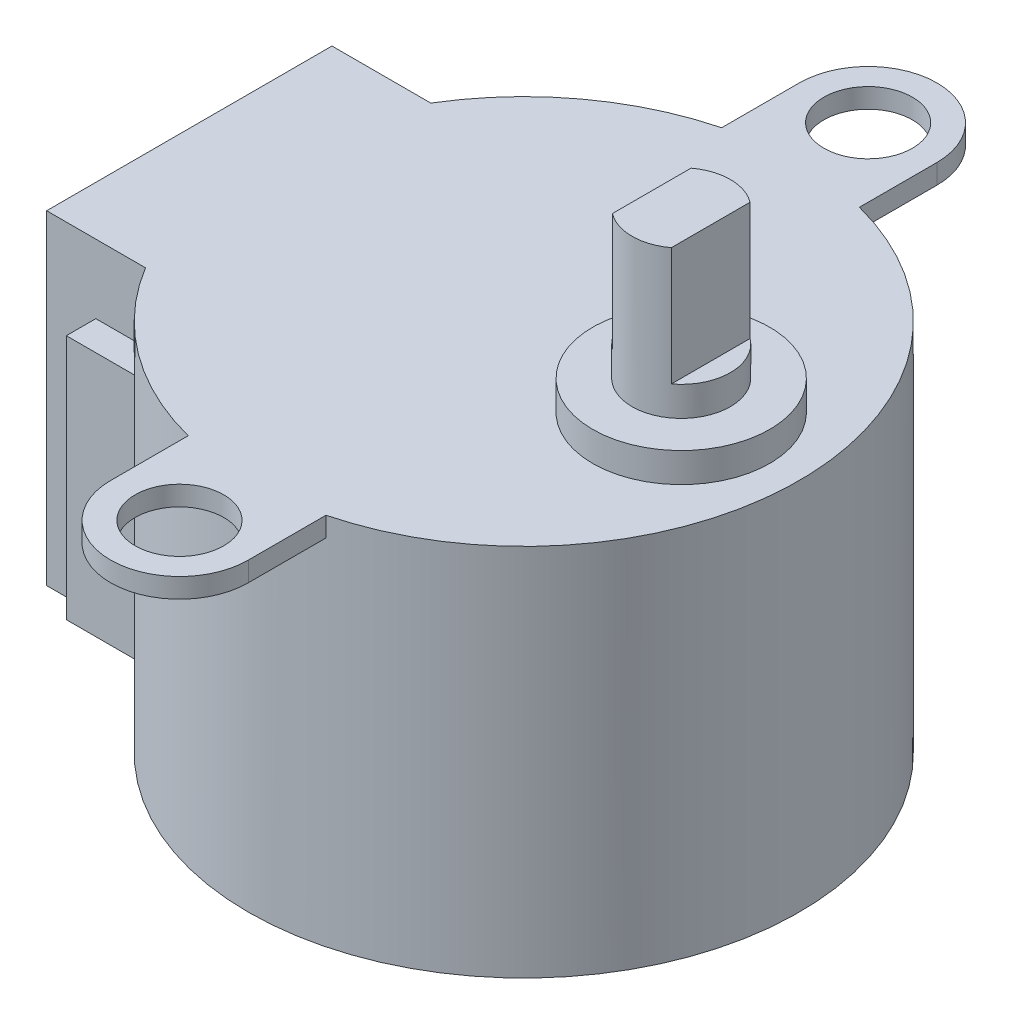
ISO-10303-21;
HEADER;
FILE_DESCRIPTION(('STEP AP214'),'2;1');
FILE_NAME('part.step','',(''),(''),'','','');
FILE_SCHEMA(('AUTOMOTIVE_DESIGN { 1 0 10303 214 1 1 1 1 }'));
ENDSEC;
DATA;
#1=APPLICATION_CONTEXT('core data for automotive mechanical design processes');
#2=APPLICATION_PROTOCOL_DEFINITION('international standard','automotive_design',2000,#1);
#3=PRODUCT_CONTEXT('',#1,'mechanical');
#4=PRODUCT('Part','Part','',(#3));
#5=PRODUCT_RELATED_PRODUCT_CATEGORY('part','',(#4));
#6=PRODUCT_DEFINITION_FORMATION('','',#4);
#7=PRODUCT_DEFINITION_CONTEXT('part definition',#1,'design');
#8=PRODUCT_DEFINITION('design','',#6,#7);
#9=PRODUCT_DEFINITION_SHAPE('','',#8);
#10=(LENGTH_UNIT() NAMED_UNIT(*) SI_UNIT(.MILLI.,.METRE.));
#11=(NAMED_UNIT(*) PLANE_ANGLE_UNIT() SI_UNIT($,.RADIAN.));
#12=(NAMED_UNIT(*) SI_UNIT($,.STERADIAN.) SOLID_ANGLE_UNIT());
#13=UNCERTAINTY_MEASURE_WITH_UNIT(LENGTH_MEASURE(1.E-05),#10,'distance_accuracy_value','');
#14=(GEOMETRIC_REPRESENTATION_CONTEXT(3) GLOBAL_UNCERTAINTY_ASSIGNED_CONTEXT((#13)) GLOBAL_UNIT_ASSIGNED_CONTEXT((#10,
#11,#12)) REPRESENTATION_CONTEXT('',''));
#15=CARTESIAN_POINT('',(0.,0.,0.));
#16=DIRECTION('',(0.,0.,1.));
#17=DIRECTION('',(1.,0.,0.));
#18=AXIS2_PLACEMENT_3D('',#15,#16,#17);
#19=CARTESIAN_POINT('',(0.,-19.,0.));
#20=DIRECTION('',(0.,1.,0.));
#21=DIRECTION('',(0.,0.,1.));
#22=AXIS2_PLACEMENT_3D('',#19,#20,#21);
#23=CYLINDRICAL_SURFACE('',#22,14.);
#24=CARTESIAN_POINT('',(0.,-19.,0.));
#25=DIRECTION('',(0.,1.,0.));
#26=DIRECTION('',(0.,0.,1.));
#27=AXIS2_PLACEMENT_3D('',#24,#25,#26);
#28=CIRCLE('',#27,14.);
#29=CARTESIAN_POINT('',(0.,-19.,14.));
#30=VERTEX_POINT('',#29);
#31=EDGE_CURVE('E298',#30,#30,#28,.T.);
#32=ORIENTED_EDGE('',*,*,#31,.T.);
#33=EDGE_LOOP('',(#32));
#34=FACE_BOUND('',#33,.T.);
#35=DIRECTION('',(0.,1.,0.));
#36=VECTOR('',#35,1.);
#37=CARTESIAN_POINT('',(-10.9287464971972,-16.,8.75));
#38=LINE('',#37,#36);
#39=CARTESIAN_POINT('',(-10.9287464971972,-16.,8.75));
#40=VERTEX_POINT('',#39);
#41=CARTESIAN_POINT('',(-10.9287464971972,-3.5,8.75));
#42=VERTEX_POINT('',#41);
#43=EDGE_CURVE('E212',#40,#42,#38,.T.);
#44=ORIENTED_EDGE('',*,*,#43,.F.);
#45=CARTESIAN_POINT('',(0.,-16.,0.));
#46=DIRECTION('',(0.,1.,0.));
#47=DIRECTION('',(0.,0.,1.));
#48=AXIS2_PLACEMENT_3D('',#45,#46,#47);
#49=CIRCLE('',#48,14.);
#50=CARTESIAN_POINT('',(-11.9765395670035,-16.,7.25));
#51=VERTEX_POINT('',#50);
#52=EDGE_CURVE('E200',#51,#40,#49,.T.);
#53=ORIENTED_EDGE('',*,*,#52,.F.);
#54=DIRECTION('',(0.,1.,0.));
#55=VECTOR('',#54,1.);
#56=CARTESIAN_POINT('',(-11.9765395670035,-16.5,7.25));
#57=LINE('',#56,#55);
#58=CARTESIAN_POINT('',(-11.9765395670035,-16.5,7.25));
#59=VERTEX_POINT('',#58);
#60=EDGE_CURVE('E210',#59,#51,#57,.T.);
#61=ORIENTED_EDGE('',*,*,#60,.F.);
#62=CARTESIAN_POINT('',(0.,-16.5,0.));
#63=DIRECTION('',(0.,1.,0.));
#64=DIRECTION('',(0.,0.,1.));
#65=AXIS2_PLACEMENT_3D('',#62,#63,#64);
#66=CIRCLE('',#65,14.);
#67=CARTESIAN_POINT('',(-11.9765395670035,-16.5,-7.25));
#68=VERTEX_POINT('',#67);
#69=EDGE_CURVE('E803',#68,#59,#66,.T.);
#70=ORIENTED_EDGE('',*,*,#69,.F.);
#71=DIRECTION('',(0.,1.,0.));
#72=VECTOR('',#71,1.);
#73=CARTESIAN_POINT('',(-11.9765395670035,-16.5,-7.25));
#74=LINE('',#73,#72);
#75=CARTESIAN_POINT('',(-11.9765395670035,-16.,-7.25));
#76=VERTEX_POINT('',#75);
#77=EDGE_CURVE('E222',#68,#76,#74,.T.);
#78=ORIENTED_EDGE('',*,*,#77,.T.);
#79=CARTESIAN_POINT('',(0.,-16.,0.));
#80=DIRECTION('',(0.,1.,0.));
#81=DIRECTION('',(0.,0.,1.));
#82=AXIS2_PLACEMENT_3D('',#79,#80,#81);
#83=CIRCLE('',#82,14.);
#84=CARTESIAN_POINT('',(-10.9287464971972,-16.,-8.75));
#85=VERTEX_POINT('',#84);
#86=EDGE_CURVE('E56',#85,#76,#83,.T.);
#87=ORIENTED_EDGE('',*,*,#86,.F.);
#88=DIRECTION('',(0.,1.,0.));
#89=VECTOR('',#88,1.);
#90=CARTESIAN_POINT('',(-10.9287464971972,-16.,-8.75));
#91=LINE('',#90,#89);
#92=CARTESIAN_POINT('',(-10.9287464971972,-3.5,-8.75));
#93=VERTEX_POINT('',#92);
#94=EDGE_CURVE('E784',#85,#93,#91,.T.);
#95=ORIENTED_EDGE('',*,*,#94,.T.);
#96=CARTESIAN_POINT('',(0.,-3.5,0.));
#97=DIRECTION('',(0.,1.,0.));
#98=DIRECTION('',(0.,0.,1.));
#99=AXIS2_PLACEMENT_3D('',#96,#97,#98);
#100=CIRCLE('',#99,14.);
#101=CARTESIAN_POINT('',(-11.9765395670035,-3.5,-7.25));
#102=VERTEX_POINT('',#101);
#103=EDGE_CURVE('E791',#93,#102,#100,.T.);
#104=ORIENTED_EDGE('',*,*,#103,.T.);
#105=CARTESIAN_POINT('',(-11.9765395670035,0.,-7.25));
#106=VERTEX_POINT('',#105);
#107=EDGE_CURVE('E219',#102,#106,#74,.T.);
#108=ORIENTED_EDGE('',*,*,#107,.T.);
#109=CARTESIAN_POINT('',(0.,0.,0.));
#110=DIRECTION('',(0.,1.,0.));
#111=DIRECTION('',(0.,0.,1.));
#112=AXIS2_PLACEMENT_3D('',#109,#110,#111);
#113=CIRCLE('',#112,14.);
#114=CARTESIAN_POINT('',(-3.5,0.,-13.555441711726));
#115=VERTEX_POINT('',#114);
#116=EDGE_CURVE('E302',#115,#106,#113,.T.);
#117=ORIENTED_EDGE('',*,*,#116,.F.);
#118=DIRECTION('',(0.,1.,0.));
#119=VECTOR('',#118,1.);
#120=CARTESIAN_POINT('',(-3.5,-1.,-13.555441711726));
#121=LINE('',#120,#119);
#122=CARTESIAN_POINT('',(-3.5,-1.,-13.555441711726));
#123=VERTEX_POINT('',#122);
#124=EDGE_CURVE('E288',#123,#115,#121,.T.);
#125=ORIENTED_EDGE('',*,*,#124,.F.);
#126=CARTESIAN_POINT('',(0.,-1.,0.));
#127=DIRECTION('',(0.,1.,0.));
#128=DIRECTION('',(0.,0.,1.));
#129=AXIS2_PLACEMENT_3D('',#126,#127,#128);
#130=CIRCLE('',#129,14.);
#131=CARTESIAN_POINT('',(3.5,-1.,-13.555441711726));
#132=VERTEX_POINT('',#131);
#133=EDGE_CURVE('E264',#132,#123,#130,.T.);
#134=ORIENTED_EDGE('',*,*,#133,.F.);
#135=DIRECTION('',(0.,1.,0.));
#136=VECTOR('',#135,1.);
#137=CARTESIAN_POINT('',(3.5,-1.,-13.555441711726));
#138=LINE('',#137,#136);
#139=CARTESIAN_POINT('',(3.5,0.,-13.555441711726));
#140=VERTEX_POINT('',#139);
#141=EDGE_CURVE('E278',#132,#140,#138,.T.);
#142=ORIENTED_EDGE('',*,*,#141,.T.);
#143=CARTESIAN_POINT('',(3.5,0.,13.555441711726));
#144=VERTEX_POINT('',#143);
#145=EDGE_CURVE('E291',#144,#140,#113,.T.);
#146=ORIENTED_EDGE('',*,*,#145,.F.);
#147=DIRECTION('',(0.,1.,0.));
#148=VECTOR('',#147,1.);
#149=CARTESIAN_POINT('',(3.5,-1.,13.555441711726));
#150=LINE('',#149,#148);
#151=CARTESIAN_POINT('',(3.5,-1.,13.555441711726));
#152=VERTEX_POINT('',#151);
#153=EDGE_CURVE('E255',#152,#144,#150,.T.);
#154=ORIENTED_EDGE('',*,*,#153,.F.);
#155=CARTESIAN_POINT('',(0.,-1.,0.));
#156=DIRECTION('',(0.,1.,0.));
#157=DIRECTION('',(0.,0.,1.));
#158=AXIS2_PLACEMENT_3D('',#155,#156,#157);
#159=CIRCLE('',#158,14.);
#160=CARTESIAN_POINT('',(-3.5,-1.,13.555441711726));
#161=VERTEX_POINT('',#160);
#162=EDGE_CURVE('E227',#161,#152,#159,.T.);
#163=ORIENTED_EDGE('',*,*,#162,.F.);
#164=DIRECTION('',(0.,1.,0.));
#165=VECTOR('',#164,1.);
#166=CARTESIAN_POINT('',(-3.5,-1.,13.555441711726));
#167=LINE('',#166,#165);
#168=CARTESIAN_POINT('',(-3.5,0.,13.555441711726));
#169=VERTEX_POINT('',#168);
#170=EDGE_CURVE('E242',#161,#169,#167,.T.);
#171=ORIENTED_EDGE('',*,*,#170,.T.);
#172=CARTESIAN_POINT('',(-11.9765395670035,0.,7.25));
#173=VERTEX_POINT('',#172);
#174=EDGE_CURVE('E305',#173,#169,#113,.T.);
#175=ORIENTED_EDGE('',*,*,#174,.F.);
#176=CARTESIAN_POINT('',(-11.9765395670035,-3.5,7.25));
#177=VERTEX_POINT('',#176);
#178=EDGE_CURVE('E220',#177,#173,#57,.T.);
#179=ORIENTED_EDGE('',*,*,#178,.F.);
#180=CARTESIAN_POINT('',(0.,-3.5,0.));
#181=DIRECTION('',(0.,1.,0.));
#182=DIRECTION('',(0.,0.,1.));
#183=AXIS2_PLACEMENT_3D('',#180,#181,#182);
#184=CIRCLE('',#183,14.);
#185=EDGE_CURVE('E48',#177,#42,#184,.T.);
#186=ORIENTED_EDGE('',*,*,#185,.T.);
#187=EDGE_LOOP('',(#44,#53,#61,#70,#78,#87,#95,#104,#108,#117,#125,#134,#142,#146,#154,#163,
#171,#175,#179,#186));
#188=FACE_BOUND('',#187,.T.);
#189=ADVANCED_FACE('F33',(#34,#188),#23,.T.);
#190=CARTESIAN_POINT('',(0.,-16.5,7.25));
#191=DIRECTION('',(0.,0.,-1.));
#192=DIRECTION('',(-1.,0.,0.));
#193=AXIS2_PLACEMENT_3D('',#190,#191,#192);
#194=PLANE('',#193);
#195=DIRECTION('',(-1.,0.,0.));
#196=VECTOR('',#195,1.);
#197=CARTESIAN_POINT('',(0.,-16.,7.25));
#198=LINE('',#197,#196);
#199=CARTESIAN_POINT('',(-14.5,-16.,7.25));
#200=VERTEX_POINT('',#199);
#201=EDGE_CURVE('E197',#51,#200,#198,.T.);
#202=ORIENTED_EDGE('',*,*,#201,.T.);
#203=DIRECTION('',(0.,1.,0.));
#204=VECTOR('',#203,1.);
#205=CARTESIAN_POINT('',(-14.5,-16.,7.25));
#206=LINE('',#205,#204);
#207=CARTESIAN_POINT('',(-14.5,-3.5,7.25));
#208=VERTEX_POINT('',#207);
#209=EDGE_CURVE('E847',#200,#208,#206,.T.);
#210=ORIENTED_EDGE('',*,*,#209,.T.);
#211=DIRECTION('',(-1.,0.,0.));
#212=VECTOR('',#211,1.);
#213=CARTESIAN_POINT('',(0.,-3.5,7.25));
#214=LINE('',#213,#212);
#215=EDGE_CURVE('E846',#177,#208,#214,.T.);
#216=ORIENTED_EDGE('',*,*,#215,.F.);
#217=ORIENTED_EDGE('',*,*,#178,.T.);
#218=DIRECTION('',(-1.,0.,0.));
#219=VECTOR('',#218,1.);
#220=CARTESIAN_POINT('',(0.,0.,7.25));
#221=LINE('',#220,#219);
#222=CARTESIAN_POINT('',(-17.,0.,7.25));
#223=VERTEX_POINT('',#222);
#224=EDGE_CURVE('E777',#173,#223,#221,.T.);
#225=ORIENTED_EDGE('',*,*,#224,.T.);
#226=DIRECTION('',(0.,1.,0.));
#227=VECTOR('',#226,1.);
#228=CARTESIAN_POINT('',(-17.,-16.5,7.25));
#229=LINE('',#228,#227);
#230=CARTESIAN_POINT('',(-17.,-16.5,7.25));
#231=VERTEX_POINT('',#230);
#232=EDGE_CURVE('E247',#231,#223,#229,.T.);
#233=ORIENTED_EDGE('',*,*,#232,.F.);
#234=DIRECTION('',(-1.,0.,0.));
#235=VECTOR('',#234,1.);
#236=CARTESIAN_POINT('',(0.,-16.5,7.25));
#237=LINE('',#236,#235);
#238=EDGE_CURVE('E218',#59,#231,#237,.T.);
#239=ORIENTED_EDGE('',*,*,#238,.F.);
#240=ORIENTED_EDGE('',*,*,#60,.T.);
#241=EDGE_LOOP('',(#202,#210,#216,#217,#225,#233,#239,#240));
#242=FACE_BOUND('',#241,.T.);
#243=ADVANCED_FACE('F216',(#242),#194,.F.);
#244=CARTESIAN_POINT('',(0.,-16.5,-7.25));
#245=DIRECTION('',(0.,0.,-1.));
#246=DIRECTION('',(-1.,0.,0.));
#247=AXIS2_PLACEMENT_3D('',#244,#245,#246);
#248=PLANE('',#247);
#249=DIRECTION('',(0.,1.,0.));
#250=VECTOR('',#249,1.);
#251=CARTESIAN_POINT('',(-14.5,-16.,-7.25));
#252=LINE('',#251,#250);
#253=CARTESIAN_POINT('',(-14.5,-16.,-7.25));
#254=VERTEX_POINT('',#253);
#255=CARTESIAN_POINT('',(-14.5,-3.5,-7.25));
#256=VERTEX_POINT('',#255);
#257=EDGE_CURVE('E769',#254,#256,#252,.T.);
#258=ORIENTED_EDGE('',*,*,#257,.F.);
#259=DIRECTION('',(-1.,0.,0.));
#260=VECTOR('',#259,1.);
#261=CARTESIAN_POINT('',(0.,-16.,-7.25));
#262=LINE('',#261,#260);
#263=EDGE_CURVE('E771',#76,#254,#262,.T.);
#264=ORIENTED_EDGE('',*,*,#263,.F.);
#265=ORIENTED_EDGE('',*,*,#77,.F.);
#266=DIRECTION('',(-1.,0.,0.));
#267=VECTOR('',#266,1.);
#268=CARTESIAN_POINT('',(0.,-16.5,-7.25));
#269=LINE('',#268,#267);
#270=CARTESIAN_POINT('',(-17.,-16.5,-7.25));
#271=VERTEX_POINT('',#270);
#272=EDGE_CURVE('E806',#68,#271,#269,.T.);
#273=ORIENTED_EDGE('',*,*,#272,.T.);
#274=DIRECTION('',(0.,1.,0.));
#275=VECTOR('',#274,1.);
#276=CARTESIAN_POINT('',(-17.,-16.5,-7.25));
#277=LINE('',#276,#275);
#278=CARTESIAN_POINT('',(-17.,0.,-7.25));
#279=VERTEX_POINT('',#278);
#280=EDGE_CURVE('E817',#271,#279,#277,.T.);
#281=ORIENTED_EDGE('',*,*,#280,.T.);
#282=DIRECTION('',(-1.,0.,0.));
#283=VECTOR('',#282,1.);
#284=CARTESIAN_POINT('',(0.,0.,-7.25));
#285=LINE('',#284,#283);
#286=EDGE_CURVE('E813',#106,#279,#285,.T.);
#287=ORIENTED_EDGE('',*,*,#286,.F.);
#288=ORIENTED_EDGE('',*,*,#107,.F.);
#289=DIRECTION('',(-1.,0.,0.));
#290=VECTOR('',#289,1.);
#291=CARTESIAN_POINT('',(0.,-3.5,-7.25));
#292=LINE('',#291,#290);
#293=EDGE_CURVE('E773',#102,#256,#292,.T.);
#294=ORIENTED_EDGE('',*,*,#293,.T.);
#295=EDGE_LOOP('',(#258,#264,#265,#273,#281,#287,#288,#294));
#296=FACE_BOUND('',#295,.T.);
#297=ADVANCED_FACE('F369',(#296),#248,.T.);
#298=CARTESIAN_POINT('',(9.5,9.,0.));
#299=DIRECTION('',(1.,0.,0.));
#300=DIRECTION('',(0.,0.,-1.));
#301=AXIS2_PLACEMENT_3D('',#298,#299,#300);
#302=PLANE('',#301);
#303=DIRECTION('',(0.,0.,1.));
#304=VECTOR('',#303,1.);
#305=CARTESIAN_POINT('',(9.5,3.,0.));
#306=LINE('',#305,#304);
#307=CARTESIAN_POINT('',(9.5,3.,-2.));
#308=VERTEX_POINT('',#307);
#309=CARTESIAN_POINT('',(9.5,3.,2.));
#310=VERTEX_POINT('',#309);
#311=EDGE_CURVE('E314',#308,#310,#306,.T.);
#312=ORIENTED_EDGE('',*,*,#311,.F.);
#313=DIRECTION('',(0.,-1.,0.));
#314=VECTOR('',#313,1.);
#315=CARTESIAN_POINT('',(9.5,9.,-2.));
#316=LINE('',#315,#314);
#317=CARTESIAN_POINT('',(9.5,9.,-2.));
#318=VERTEX_POINT('',#317);
#319=EDGE_CURVE('E11',#318,#308,#316,.T.);
#320=ORIENTED_EDGE('',*,*,#319,.F.);
#321=DIRECTION('',(0.,0.,1.));
#322=VECTOR('',#321,1.);
#323=CARTESIAN_POINT('',(9.5,9.,0.));
#324=LINE('',#323,#322);
#325=CARTESIAN_POINT('',(9.5,9.,2.));
#326=VERTEX_POINT('',#325);
#327=EDGE_CURVE('E324',#318,#326,#324,.T.);
#328=ORIENTED_EDGE('',*,*,#327,.T.);
#329=DIRECTION('',(0.,-1.,0.));
#330=VECTOR('',#329,1.);
#331=CARTESIAN_POINT('',(9.5,9.,2.));
#332=LINE('',#331,#330);
#333=EDGE_CURVE('E332',#326,#310,#332,.T.);
#334=ORIENTED_EDGE('',*,*,#333,.T.);
#335=EDGE_LOOP('',(#312,#320,#328,#334));
#336=FACE_BOUND('',#335,.T.);
#337=ADVANCED_FACE('F35',(#336),#302,.T.);
#338=CARTESIAN_POINT('',(6.5,9.,0.));
#339=DIRECTION('',(1.,0.,0.));
#340=DIRECTION('',(0.,0.,-1.));
#341=AXIS2_PLACEMENT_3D('',#338,#339,#340);
#342=PLANE('',#341);
#343=DIRECTION('',(0.,-1.,0.));
#344=VECTOR('',#343,1.);
#345=CARTESIAN_POINT('',(6.5,9.,-2.));
#346=LINE('',#345,#344);
#347=CARTESIAN_POINT('',(6.5,9.,-2.));
#348=VERTEX_POINT('',#347);
#349=CARTESIAN_POINT('',(6.5,3.,-2.));
#350=VERTEX_POINT('',#349);
#351=EDGE_CURVE('E41',#348,#350,#346,.T.);
#352=ORIENTED_EDGE('',*,*,#351,.T.);
#353=DIRECTION('',(0.,0.,1.));
#354=VECTOR('',#353,1.);
#355=CARTESIAN_POINT('',(6.5,3.,0.));
#356=LINE('',#355,#354);
#357=CARTESIAN_POINT('',(6.5,3.,2.));
#358=VERTEX_POINT('',#357);
#359=EDGE_CURVE('E319',#350,#358,#356,.T.);
#360=ORIENTED_EDGE('',*,*,#359,.T.);
#361=DIRECTION('',(0.,-1.,0.));
#362=VECTOR('',#361,1.);
#363=CARTESIAN_POINT('',(6.5,9.,2.));
#364=LINE('',#363,#362);
#365=CARTESIAN_POINT('',(6.5,9.,2.));
#366=VERTEX_POINT('',#365);
#367=EDGE_CURVE('E335',#366,#358,#364,.T.);
#368=ORIENTED_EDGE('',*,*,#367,.F.);
#369=DIRECTION('',(0.,0.,1.));
#370=VECTOR('',#369,1.);
#371=CARTESIAN_POINT('',(6.5,9.,0.));
#372=LINE('',#371,#370);
#373=EDGE_CURVE('E329',#348,#366,#372,.T.);
#374=ORIENTED_EDGE('',*,*,#373,.F.);
#375=EDGE_LOOP('',(#352,#360,#368,#374));
#376=FACE_BOUND('',#375,.T.);
#377=ADVANCED_FACE('F341',(#376),#342,.F.);
#378=CARTESIAN_POINT('',(8.,9.,0.));
#379=DIRECTION('',(0.,-1.,0.));
#380=DIRECTION('',(0.,0.,-1.));
#381=AXIS2_PLACEMENT_3D('',#378,#379,#380);
#382=CYLINDRICAL_SURFACE('',#381,2.5);
#383=CARTESIAN_POINT('',(8.,1.5,0.));
#384=DIRECTION('',(0.,1.,0.));
#385=DIRECTION('',(0.,0.,1.));
#386=AXIS2_PLACEMENT_3D('',#383,#384,#385);
#387=CIRCLE('',#386,2.5);
#388=CARTESIAN_POINT('',(8.,1.5,2.5));
#389=VERTEX_POINT('',#388);
#390=EDGE_CURVE('E308',#389,#389,#387,.T.);
#391=ORIENTED_EDGE('',*,*,#390,.T.);
#392=EDGE_LOOP('',(#391));
#393=FACE_BOUND('',#392,.T.);
#394=CARTESIAN_POINT('',(8.,3.,0.));
#395=DIRECTION('',(0.,1.,0.));
#396=DIRECTION('',(0.,0.,1.));
#397=AXIS2_PLACEMENT_3D('',#394,#395,#396);
#398=CIRCLE('',#397,2.5);
#399=EDGE_CURVE('E317',#310,#308,#398,.T.);
#400=ORIENTED_EDGE('',*,*,#399,.F.);
#401=ORIENTED_EDGE('',*,*,#333,.F.);
#402=CARTESIAN_POINT('',(8.,9.,0.));
#403=DIRECTION('',(0.,1.,0.));
#404=DIRECTION('',(0.,0.,1.));
#405=AXIS2_PLACEMENT_3D('',#402,#403,#404);
#406=CIRCLE('',#405,2.5);
#407=EDGE_CURVE('E330',#366,#326,#406,.T.);
#408=ORIENTED_EDGE('',*,*,#407,.F.);
#409=ORIENTED_EDGE('',*,*,#367,.T.);
#410=CARTESIAN_POINT('',(8.,3.,0.));
#411=DIRECTION('',(0.,1.,0.));
#412=DIRECTION('',(0.,0.,1.));
#413=AXIS2_PLACEMENT_3D('',#410,#411,#412);
#414=CIRCLE('',#413,2.5);
#415=EDGE_CURVE('E321',#350,#358,#414,.T.);
#416=ORIENTED_EDGE('',*,*,#415,.F.);
#417=ORIENTED_EDGE('',*,*,#351,.F.);
#418=EDGE_CURVE('E327',#318,#348,#406,.T.);
#419=ORIENTED_EDGE('',*,*,#418,.F.);
#420=ORIENTED_EDGE('',*,*,#319,.T.);
#421=EDGE_LOOP('',(#400,#401,#408,#409,#416,#417,#419,#420));
#422=FACE_BOUND('',#421,.T.);
#423=ADVANCED_FACE('F346',(#393,#422),#382,.T.);
#424=CARTESIAN_POINT('',(0.,9.,0.));
#425=DIRECTION('',(0.,1.,0.));
#426=DIRECTION('',(0.,0.,1.));
#427=AXIS2_PLACEMENT_3D('',#424,#425,#426);
#428=PLANE('',#427);
#429=ORIENTED_EDGE('',*,*,#327,.F.);
#430=ORIENTED_EDGE('',*,*,#418,.T.);
#431=ORIENTED_EDGE('',*,*,#373,.T.);
#432=ORIENTED_EDGE('',*,*,#407,.T.);
#433=EDGE_LOOP('',(#429,#430,#431,#432));
#434=FACE_BOUND('',#433,.T.);
#435=ADVANCED_FACE('F352',(#434),#428,.T.);
#436=CARTESIAN_POINT('',(0.,3.,0.));
#437=DIRECTION('',(0.,1.,0.));
#438=DIRECTION('',(0.,0.,1.));
#439=AXIS2_PLACEMENT_3D('',#436,#437,#438);
#440=PLANE('',#439);
#441=ORIENTED_EDGE('',*,*,#359,.F.);
#442=ORIENTED_EDGE('',*,*,#415,.T.);
#443=EDGE_LOOP('',(#441,#442));
#444=FACE_BOUND('',#443,.T.);
#445=ADVANCED_FACE('F349',(#444),#440,.T.);
#446=CARTESIAN_POINT('',(0.,3.,0.));
#447=DIRECTION('',(0.,1.,0.));
#448=DIRECTION('',(0.,0.,1.));
#449=AXIS2_PLACEMENT_3D('',#446,#447,#448);
#450=PLANE('',#449);
#451=ORIENTED_EDGE('',*,*,#311,.T.);
#452=ORIENTED_EDGE('',*,*,#399,.T.);
#453=EDGE_LOOP('',(#451,#452));
#454=FACE_BOUND('',#453,.T.);
#455=ADVANCED_FACE('F351',(#454),#450,.T.);
#456=CARTESIAN_POINT('',(8.,1.5,0.));
#457=DIRECTION('',(0.,-1.,0.));
#458=DIRECTION('',(0.,0.,-1.));
#459=AXIS2_PLACEMENT_3D('',#456,#457,#458);
#460=CYLINDRICAL_SURFACE('',#459,4.5);
#461=CARTESIAN_POINT('',(8.,1.5,0.));
#462=DIRECTION('',(0.,1.,0.));
#463=DIRECTION('',(0.,0.,1.));
#464=AXIS2_PLACEMENT_3D('',#461,#462,#463);
#465=CIRCLE('',#464,4.5);
#466=CARTESIAN_POINT('',(8.,1.5,4.5));
#467=VERTEX_POINT('',#466);
#468=EDGE_CURVE('E311',#467,#467,#465,.T.);
#469=ORIENTED_EDGE('',*,*,#468,.F.);
#470=EDGE_LOOP('',(#469));
#471=FACE_BOUND('',#470,.T.);
#472=CARTESIAN_POINT('',(8.,0.,0.));
#473=DIRECTION('',(0.,1.,0.));
#474=DIRECTION('',(0.,0.,1.));
#475=AXIS2_PLACEMENT_3D('',#472,#473,#474);
#476=CIRCLE('',#475,4.5);
#477=CARTESIAN_POINT('',(8.,0.,4.5));
#478=VERTEX_POINT('',#477);
#479=EDGE_CURVE('E301',#478,#478,#476,.T.);
#480=ORIENTED_EDGE('',*,*,#479,.T.);
#481=EDGE_LOOP('',(#480));
#482=FACE_BOUND('',#481,.T.);
#483=ADVANCED_FACE('F358',(#471,#482),#460,.T.);
#484=CARTESIAN_POINT('',(0.,1.5,0.));
#485=DIRECTION('',(0.,1.,0.));
#486=DIRECTION('',(0.,0.,1.));
#487=AXIS2_PLACEMENT_3D('',#484,#485,#486);
#488=PLANE('',#487);
#489=ORIENTED_EDGE('',*,*,#390,.F.);
#490=EDGE_LOOP('',(#489));
#491=FACE_BOUND('',#490,.T.);
#492=ORIENTED_EDGE('',*,*,#468,.T.);
#493=EDGE_LOOP('',(#492));
#494=FACE_BOUND('',#493,.T.);
#495=ADVANCED_FACE('F375',(#491,#494),#488,.T.);
#496=CARTESIAN_POINT('',(0.,-19.,0.));
#497=DIRECTION('',(0.,1.,0.));
#498=DIRECTION('',(0.,0.,1.));
#499=AXIS2_PLACEMENT_3D('',#496,#497,#498);
#500=PLANE('',#499);
#501=ORIENTED_EDGE('',*,*,#31,.F.);
#502=EDGE_LOOP('',(#501));
#503=FACE_BOUND('',#502,.T.);
#504=ADVANCED_FACE('F378',(#503),#500,.F.);
#505=CARTESIAN_POINT('',(0.,0.,0.));
#506=DIRECTION('',(0.,1.,0.));
#507=DIRECTION('',(0.,0.,1.));
#508=AXIS2_PLACEMENT_3D('',#505,#506,#507);
#509=PLANE('',#508);
#510=ORIENTED_EDGE('',*,*,#479,.F.);
#511=EDGE_LOOP('',(#510));
#512=FACE_BOUND('',#511,.T.);
#513=ORIENTED_EDGE('',*,*,#116,.T.);
#514=ORIENTED_EDGE('',*,*,#286,.T.);
#515=DIRECTION('',(0.,0.,1.));
#516=VECTOR('',#515,1.);
#517=CARTESIAN_POINT('',(-17.,0.,0.));
#518=LINE('',#517,#516);
#519=EDGE_CURVE('E804',#279,#223,#518,.T.);
#520=ORIENTED_EDGE('',*,*,#519,.T.);
#521=ORIENTED_EDGE('',*,*,#224,.F.);
#522=ORIENTED_EDGE('',*,*,#174,.T.);
#523=DIRECTION('',(0.,0.,1.));
#524=VECTOR('',#523,1.);
#525=CARTESIAN_POINT('',(-3.5,0.,0.));
#526=LINE('',#525,#524);
#527=CARTESIAN_POINT('',(-3.5,0.,17.5));
#528=VERTEX_POINT('',#527);
#529=EDGE_CURVE('E243',#169,#528,#526,.T.);
#530=ORIENTED_EDGE('',*,*,#529,.T.);
#531=CARTESIAN_POINT('',(0.,0.,17.5));
#532=DIRECTION('',(0.,1.,0.));
#533=DIRECTION('',(0.,0.,1.));
#534=AXIS2_PLACEMENT_3D('',#531,#532,#533);
#535=CIRCLE('',#534,3.5);
#536=CARTESIAN_POINT('',(3.5,0.,17.5));
#537=VERTEX_POINT('',#536);
#538=EDGE_CURVE('E246',#528,#537,#535,.T.);
#539=ORIENTED_EDGE('',*,*,#538,.T.);
#540=DIRECTION('',(0.,0.,1.));
#541=VECTOR('',#540,1.);
#542=CARTESIAN_POINT('',(3.5,0.,0.));
#543=LINE('',#542,#541);
#544=EDGE_CURVE('E250',#144,#537,#543,.T.);
#545=ORIENTED_EDGE('',*,*,#544,.F.);
#546=ORIENTED_EDGE('',*,*,#145,.T.);
#547=DIRECTION('',(0.,0.,1.));
#548=VECTOR('',#547,1.);
#549=CARTESIAN_POINT('',(3.5,0.,0.));
#550=LINE('',#549,#548);
#551=CARTESIAN_POINT('',(3.5,0.,-17.5));
#552=VERTEX_POINT('',#551);
#553=EDGE_CURVE('E257',#552,#140,#550,.T.);
#554=ORIENTED_EDGE('',*,*,#553,.F.);
#555=CARTESIAN_POINT('',(0.,0.,-17.5));
#556=DIRECTION('',(0.,1.,0.));
#557=DIRECTION('',(0.,0.,1.));
#558=AXIS2_PLACEMENT_3D('',#555,#556,#557);
#559=CIRCLE('',#558,3.5);
#560=CARTESIAN_POINT('',(-3.5,0.,-17.5));
#561=VERTEX_POINT('',#560);
#562=EDGE_CURVE('E281',#552,#561,#559,.T.);
#563=ORIENTED_EDGE('',*,*,#562,.T.);
#564=DIRECTION('',(0.,0.,1.));
#565=VECTOR('',#564,1.);
#566=CARTESIAN_POINT('',(-3.5,0.,0.));
#567=LINE('',#566,#565);
#568=EDGE_CURVE('E284',#561,#115,#567,.T.);
#569=ORIENTED_EDGE('',*,*,#568,.T.);
#570=EDGE_LOOP('',(#513,#514,#520,#521,#522,#530,#539,#545,#546,#554,#563,#569));
#571=FACE_BOUND('',#570,.T.);
#572=CARTESIAN_POINT('',(0.,0.,-17.5));
#573=DIRECTION('',(0.,1.,0.));
#574=DIRECTION('',(0.,0.,1.));
#575=AXIS2_PLACEMENT_3D('',#572,#573,#574);
#576=CIRCLE('',#575,2.25);
#577=CARTESIAN_POINT('',(0.,0.,-15.25));
#578=VERTEX_POINT('',#577);
#579=EDGE_CURVE('E267',#578,#578,#576,.T.);
#580=ORIENTED_EDGE('',*,*,#579,.F.);
#581=EDGE_LOOP('',(#580));
#582=FACE_BOUND('',#581,.T.);
#583=CARTESIAN_POINT('',(0.,0.,17.5));
#584=DIRECTION('',(0.,1.,0.));
#585=DIRECTION('',(0.,0.,1.));
#586=AXIS2_PLACEMENT_3D('',#583,#584,#585);
#587=CIRCLE('',#586,2.25);
#588=CARTESIAN_POINT('',(0.,0.,19.75));
#589=VERTEX_POINT('',#588);
#590=EDGE_CURVE('E231',#589,#589,#587,.T.);
#591=ORIENTED_EDGE('',*,*,#590,.F.);
#592=EDGE_LOOP('',(#591));
#593=FACE_BOUND('',#592,.T.);
#594=ADVANCED_FACE('F373',(#512,#571,#582,#593),#509,.T.);
#595=CARTESIAN_POINT('',(-3.5,-1.,0.));
#596=DIRECTION('',(-1.,0.,0.));
#597=DIRECTION('',(0.,0.,1.));
#598=AXIS2_PLACEMENT_3D('',#595,#596,#597);
#599=PLANE('',#598);
#600=ORIENTED_EDGE('',*,*,#568,.F.);
#601=DIRECTION('',(0.,1.,0.));
#602=VECTOR('',#601,1.);
#603=CARTESIAN_POINT('',(-3.5,-1.,-17.5));
#604=LINE('',#603,#602);
#605=CARTESIAN_POINT('',(-3.5,-1.,-17.5));
#606=VERTEX_POINT('',#605);
#607=EDGE_CURVE('E292',#606,#561,#604,.T.);
#608=ORIENTED_EDGE('',*,*,#607,.F.);
#609=DIRECTION('',(0.,0.,1.));
#610=VECTOR('',#609,1.);
#611=CARTESIAN_POINT('',(-3.5,-1.,0.));
#612=LINE('',#611,#610);
#613=EDGE_CURVE('E272',#606,#123,#612,.T.);
#614=ORIENTED_EDGE('',*,*,#613,.T.);
#615=ORIENTED_EDGE('',*,*,#124,.T.);
#616=EDGE_LOOP('',(#600,#608,#614,#615));
#617=FACE_BOUND('',#616,.T.);
#618=ADVANCED_FACE('F390',(#617),#599,.T.);
#619=CARTESIAN_POINT('',(0.,-1.,-17.5));
#620=DIRECTION('',(0.,1.,0.));
#621=DIRECTION('',(0.,0.,1.));
#622=AXIS2_PLACEMENT_3D('',#619,#620,#621);
#623=CYLINDRICAL_SURFACE('',#622,3.5);
#624=ORIENTED_EDGE('',*,*,#562,.F.);
#625=DIRECTION('',(0.,1.,0.));
#626=VECTOR('',#625,1.);
#627=CARTESIAN_POINT('',(3.5,-1.,-17.5));
#628=LINE('',#627,#626);
#629=CARTESIAN_POINT('',(3.5,-1.,-17.5));
#630=VERTEX_POINT('',#629);
#631=EDGE_CURVE('E294',#630,#552,#628,.T.);
#632=ORIENTED_EDGE('',*,*,#631,.F.);
#633=CARTESIAN_POINT('',(0.,-1.,-17.5));
#634=DIRECTION('',(0.,1.,0.));
#635=DIRECTION('',(0.,0.,1.));
#636=AXIS2_PLACEMENT_3D('',#633,#634,#635);
#637=CIRCLE('',#636,3.5);
#638=EDGE_CURVE('E269',#630,#606,#637,.T.);
#639=ORIENTED_EDGE('',*,*,#638,.T.);
#640=ORIENTED_EDGE('',*,*,#607,.T.);
#641=EDGE_LOOP('',(#624,#632,#639,#640));
#642=FACE_BOUND('',#641,.T.);
#643=ADVANCED_FACE('F434',(#642),#623,.T.);
#644=CARTESIAN_POINT('',(3.5,-1.,0.));
#645=DIRECTION('',(-1.,0.,0.));
#646=DIRECTION('',(0.,0.,1.));
#647=AXIS2_PLACEMENT_3D('',#644,#645,#646);
#648=PLANE('',#647);
#649=ORIENTED_EDGE('',*,*,#553,.T.);
#650=ORIENTED_EDGE('',*,*,#141,.F.);
#651=DIRECTION('',(0.,0.,1.));
#652=VECTOR('',#651,1.);
#653=CARTESIAN_POINT('',(3.5,-1.,0.));
#654=LINE('',#653,#652);
#655=EDGE_CURVE('E266',#630,#132,#654,.T.);
#656=ORIENTED_EDGE('',*,*,#655,.F.);
#657=ORIENTED_EDGE('',*,*,#631,.T.);
#658=EDGE_LOOP('',(#649,#650,#656,#657));
#659=FACE_BOUND('',#658,.T.);
#660=ADVANCED_FACE('F430',(#659),#648,.F.);
#661=CARTESIAN_POINT('',(0.,-1.,-17.5));
#662=DIRECTION('',(0.,1.,0.));
#663=DIRECTION('',(0.,0.,1.));
#664=AXIS2_PLACEMENT_3D('',#661,#662,#663);
#665=CYLINDRICAL_SURFACE('',#664,2.25);
#666=CARTESIAN_POINT('',(0.,-1.,-17.5));
#667=DIRECTION('',(0.,1.,0.));
#668=DIRECTION('',(0.,0.,1.));
#669=AXIS2_PLACEMENT_3D('',#666,#667,#668);
#670=CIRCLE('',#669,2.25);
#671=CARTESIAN_POINT('',(0.,-1.,-15.25));
#672=VERTEX_POINT('',#671);
#673=EDGE_CURVE('E275',#672,#672,#670,.T.);
#674=ORIENTED_EDGE('',*,*,#673,.F.);
#675=EDGE_LOOP('',(#674));
#676=FACE_BOUND('',#675,.T.);
#677=ORIENTED_EDGE('',*,*,#579,.T.);
#678=EDGE_LOOP('',(#677));
#679=FACE_BOUND('',#678,.T.);
#680=ADVANCED_FACE('F426',(#676,#679),#665,.F.);
#681=CARTESIAN_POINT('',(0.,-1.,0.));
#682=DIRECTION('',(0.,1.,0.));
#683=DIRECTION('',(0.,0.,1.));
#684=AXIS2_PLACEMENT_3D('',#681,#682,#683);
#685=PLANE('',#684);
#686=ORIENTED_EDGE('',*,*,#133,.T.);
#687=ORIENTED_EDGE('',*,*,#613,.F.);
#688=ORIENTED_EDGE('',*,*,#638,.F.);
#689=ORIENTED_EDGE('',*,*,#655,.T.);
#690=EDGE_LOOP('',(#686,#687,#688,#689));
#691=FACE_BOUND('',#690,.T.);
#692=ORIENTED_EDGE('',*,*,#673,.T.);
#693=EDGE_LOOP('',(#692));
#694=FACE_BOUND('',#693,.T.);
#695=ADVANCED_FACE('F419',(#691,#694),#685,.F.);
#696=CARTESIAN_POINT('',(3.5,-1.,0.));
#697=DIRECTION('',(-1.,0.,0.));
#698=DIRECTION('',(0.,0.,1.));
#699=AXIS2_PLACEMENT_3D('',#696,#697,#698);
#700=PLANE('',#699);
#701=ORIENTED_EDGE('',*,*,#544,.T.);
#702=DIRECTION('',(0.,1.,0.));
#703=VECTOR('',#702,1.);
#704=CARTESIAN_POINT('',(3.5,-1.,17.5));
#705=LINE('',#704,#703);
#706=CARTESIAN_POINT('',(3.5,-1.,17.5));
#707=VERTEX_POINT('',#706);
#708=EDGE_CURVE('E258',#707,#537,#705,.T.);
#709=ORIENTED_EDGE('',*,*,#708,.F.);
#710=DIRECTION('',(0.,0.,1.));
#711=VECTOR('',#710,1.);
#712=CARTESIAN_POINT('',(3.5,-1.,0.));
#713=LINE('',#712,#711);
#714=EDGE_CURVE('E237',#152,#707,#713,.T.);
#715=ORIENTED_EDGE('',*,*,#714,.F.);
#716=ORIENTED_EDGE('',*,*,#153,.T.);
#717=EDGE_LOOP('',(#701,#709,#715,#716));
#718=FACE_BOUND('',#717,.T.);
#719=ADVANCED_FACE('F416',(#718),#700,.F.);
#720=CARTESIAN_POINT('',(0.,-1.,17.5));
#721=DIRECTION('',(0.,1.,0.));
#722=DIRECTION('',(0.,0.,1.));
#723=AXIS2_PLACEMENT_3D('',#720,#721,#722);
#724=CYLINDRICAL_SURFACE('',#723,3.5);
#725=ORIENTED_EDGE('',*,*,#538,.F.);
#726=DIRECTION('',(0.,1.,0.));
#727=VECTOR('',#726,1.);
#728=CARTESIAN_POINT('',(-3.5,-1.,17.5));
#729=LINE('',#728,#727);
#730=CARTESIAN_POINT('',(-3.5,-1.,17.5));
#731=VERTEX_POINT('',#730);
#732=EDGE_CURVE('E260',#731,#528,#729,.T.);
#733=ORIENTED_EDGE('',*,*,#732,.F.);
#734=CARTESIAN_POINT('',(0.,-1.,17.5));
#735=DIRECTION('',(0.,1.,0.));
#736=DIRECTION('',(0.,0.,1.));
#737=AXIS2_PLACEMENT_3D('',#734,#735,#736);
#738=CIRCLE('',#737,3.5);
#739=EDGE_CURVE('E234',#731,#707,#738,.T.);
#740=ORIENTED_EDGE('',*,*,#739,.T.);
#741=ORIENTED_EDGE('',*,*,#708,.T.);
#742=EDGE_LOOP('',(#725,#733,#740,#741));
#743=FACE_BOUND('',#742,.T.);
#744=ADVANCED_FACE('F411',(#743),#724,.T.);
#745=CARTESIAN_POINT('',(-3.5,-1.,0.));
#746=DIRECTION('',(-1.,0.,0.));
#747=DIRECTION('',(0.,0.,1.));
#748=AXIS2_PLACEMENT_3D('',#745,#746,#747);
#749=PLANE('',#748);
#750=ORIENTED_EDGE('',*,*,#529,.F.);
#751=ORIENTED_EDGE('',*,*,#170,.F.);
#752=DIRECTION('',(0.,0.,1.));
#753=VECTOR('',#752,1.);
#754=CARTESIAN_POINT('',(-3.5,-1.,0.));
#755=LINE('',#754,#753);
#756=EDGE_CURVE('E230',#161,#731,#755,.T.);
#757=ORIENTED_EDGE('',*,*,#756,.T.);
#758=ORIENTED_EDGE('',*,*,#732,.T.);
#759=EDGE_LOOP('',(#750,#751,#757,#758));
#760=FACE_BOUND('',#759,.T.);
#761=ADVANCED_FACE('F401',(#760),#749,.T.);
#762=CARTESIAN_POINT('',(0.,-1.,17.5));
#763=DIRECTION('',(0.,1.,0.));
#764=DIRECTION('',(0.,0.,1.));
#765=AXIS2_PLACEMENT_3D('',#762,#763,#764);
#766=CYLINDRICAL_SURFACE('',#765,2.25);
#767=CARTESIAN_POINT('',(0.,-1.,17.5));
#768=DIRECTION('',(0.,1.,0.));
#769=DIRECTION('',(0.,0.,1.));
#770=AXIS2_PLACEMENT_3D('',#767,#768,#769);
#771=CIRCLE('',#770,2.25);
#772=CARTESIAN_POINT('',(0.,-1.,19.75));
#773=VERTEX_POINT('',#772);
#774=EDGE_CURVE('E239',#773,#773,#771,.T.);
#775=ORIENTED_EDGE('',*,*,#774,.F.);
#776=EDGE_LOOP('',(#775));
#777=FACE_BOUND('',#776,.T.);
#778=ORIENTED_EDGE('',*,*,#590,.T.);
#779=EDGE_LOOP('',(#778));
#780=FACE_BOUND('',#779,.T.);
#781=ADVANCED_FACE('F398',(#777,#780),#766,.F.);
#782=CARTESIAN_POINT('',(0.,-1.,0.));
#783=DIRECTION('',(0.,1.,0.));
#784=DIRECTION('',(0.,0.,1.));
#785=AXIS2_PLACEMENT_3D('',#782,#783,#784);
#786=PLANE('',#785);
#787=ORIENTED_EDGE('',*,*,#162,.T.);
#788=ORIENTED_EDGE('',*,*,#714,.T.);
#789=ORIENTED_EDGE('',*,*,#739,.F.);
#790=ORIENTED_EDGE('',*,*,#756,.F.);
#791=EDGE_LOOP('',(#787,#788,#789,#790));
#792=FACE_BOUND('',#791,.T.);
#793=ORIENTED_EDGE('',*,*,#774,.T.);
#794=EDGE_LOOP('',(#793));
#795=FACE_BOUND('',#794,.T.);
#796=ADVANCED_FACE('F400',(#792,#795),#786,.F.);
#797=CARTESIAN_POINT('',(-17.,-16.5,0.));
#798=DIRECTION('',(-1.,0.,0.));
#799=DIRECTION('',(0.,0.,1.));
#800=AXIS2_PLACEMENT_3D('',#797,#798,#799);
#801=PLANE('',#800);
#802=ORIENTED_EDGE('',*,*,#519,.F.);
#803=ORIENTED_EDGE('',*,*,#280,.F.);
#804=DIRECTION('',(0.,0.,1.));
#805=VECTOR('',#804,1.);
#806=CARTESIAN_POINT('',(-17.,-16.5,0.));
#807=LINE('',#806,#805);
#808=EDGE_CURVE('E224',#271,#231,#807,.T.);
#809=ORIENTED_EDGE('',*,*,#808,.T.);
#810=ORIENTED_EDGE('',*,*,#232,.T.);
#811=EDGE_LOOP('',(#802,#803,#809,#810));
#812=FACE_BOUND('',#811,.T.);
#813=ADVANCED_FACE('F408',(#812),#801,.T.);
#814=CARTESIAN_POINT('',(0.,-16.5,0.));
#815=DIRECTION('',(0.,1.,0.));
#816=DIRECTION('',(0.,0.,1.));
#817=AXIS2_PLACEMENT_3D('',#814,#815,#816);
#818=PLANE('',#817);
#819=ORIENTED_EDGE('',*,*,#238,.T.);
#820=ORIENTED_EDGE('',*,*,#808,.F.);
#821=ORIENTED_EDGE('',*,*,#272,.F.);
#822=ORIENTED_EDGE('',*,*,#69,.T.);
#823=EDGE_LOOP('',(#819,#820,#821,#822));
#824=FACE_BOUND('',#823,.T.);
#825=ADVANCED_FACE('F503',(#824),#818,.F.);
#826=CARTESIAN_POINT('',(-14.5,-16.,0.));
#827=DIRECTION('',(-1.,0.,0.));
#828=DIRECTION('',(0.,0.,1.));
#829=AXIS2_PLACEMENT_3D('',#826,#827,#828);
#830=PLANE('',#829);
#831=DIRECTION('',(0.,0.,1.));
#832=VECTOR('',#831,1.);
#833=CARTESIAN_POINT('',(-14.5,-3.5,0.));
#834=LINE('',#833,#832);
#835=CARTESIAN_POINT('',(-14.5,-3.5,-8.75));
#836=VERTEX_POINT('',#835);
#837=EDGE_CURVE('E797',#836,#256,#834,.T.);
#838=ORIENTED_EDGE('',*,*,#837,.F.);
#839=DIRECTION('',(0.,1.,0.));
#840=VECTOR('',#839,1.);
#841=CARTESIAN_POINT('',(-14.5,-16.,-8.75));
#842=LINE('',#841,#840);
#843=CARTESIAN_POINT('',(-14.5,-16.,-8.75));
#844=VERTEX_POINT('',#843);
#845=EDGE_CURVE('E778',#844,#836,#842,.T.);
#846=ORIENTED_EDGE('',*,*,#845,.F.);
#847=DIRECTION('',(0.,0.,1.));
#848=VECTOR('',#847,1.);
#849=CARTESIAN_POINT('',(-14.5,-16.,0.));
#850=LINE('',#849,#848);
#851=EDGE_CURVE('E782',#844,#254,#850,.T.);
#852=ORIENTED_EDGE('',*,*,#851,.T.);
#853=ORIENTED_EDGE('',*,*,#257,.T.);
#854=EDGE_LOOP('',(#838,#846,#852,#853));
#855=FACE_BOUND('',#854,.T.);
#856=ADVANCED_FACE('F511',(#855),#830,.T.);
#857=CARTESIAN_POINT('',(0.,-16.,-8.75));
#858=DIRECTION('',(0.,0.,-1.));
#859=DIRECTION('',(-1.,0.,0.));
#860=AXIS2_PLACEMENT_3D('',#857,#858,#859);
#861=PLANE('',#860);
#862=DIRECTION('',(-1.,0.,0.));
#863=VECTOR('',#862,1.);
#864=CARTESIAN_POINT('',(0.,-3.5,-8.75));
#865=LINE('',#864,#863);
#866=EDGE_CURVE('E794',#93,#836,#865,.T.);
#867=ORIENTED_EDGE('',*,*,#866,.F.);
#868=ORIENTED_EDGE('',*,*,#94,.F.);
#869=DIRECTION('',(-1.,0.,0.));
#870=VECTOR('',#869,1.);
#871=CARTESIAN_POINT('',(0.,-16.,-8.75));
#872=LINE('',#871,#870);
#873=EDGE_CURVE('E786',#85,#844,#872,.T.);
#874=ORIENTED_EDGE('',*,*,#873,.T.);
#875=ORIENTED_EDGE('',*,*,#845,.T.);
#876=EDGE_LOOP('',(#867,#868,#874,#875));
#877=FACE_BOUND('',#876,.T.);
#878=ADVANCED_FACE('F519',(#877),#861,.T.);
#879=CARTESIAN_POINT('',(0.,-16.,0.));
#880=DIRECTION('',(0.,1.,0.));
#881=DIRECTION('',(0.,0.,1.));
#882=AXIS2_PLACEMENT_3D('',#879,#880,#881);
#883=PLANE('',#882);
#884=ORIENTED_EDGE('',*,*,#86,.T.);
#885=ORIENTED_EDGE('',*,*,#263,.T.);
#886=ORIENTED_EDGE('',*,*,#851,.F.);
#887=ORIENTED_EDGE('',*,*,#873,.F.);
#888=EDGE_LOOP('',(#884,#885,#886,#887));
#889=FACE_BOUND('',#888,.T.);
#890=ADVANCED_FACE('F528',(#889),#883,.F.);
#891=CARTESIAN_POINT('',(0.,-3.5,0.));
#892=DIRECTION('',(0.,1.,0.));
#893=DIRECTION('',(0.,0.,1.));
#894=AXIS2_PLACEMENT_3D('',#891,#892,#893);
#895=PLANE('',#894);
#896=ORIENTED_EDGE('',*,*,#103,.F.);
#897=ORIENTED_EDGE('',*,*,#866,.T.);
#898=ORIENTED_EDGE('',*,*,#837,.T.);
#899=ORIENTED_EDGE('',*,*,#293,.F.);
#900=EDGE_LOOP('',(#896,#897,#898,#899));
#901=FACE_BOUND('',#900,.T.);
#902=ADVANCED_FACE('F536',(#901),#895,.T.);
#903=CARTESIAN_POINT('',(0.,-16.,8.75));
#904=DIRECTION('',(0.,0.,-1.));
#905=DIRECTION('',(-1.,0.,0.));
#906=AXIS2_PLACEMENT_3D('',#903,#904,#905);
#907=PLANE('',#906);
#908=DIRECTION('',(-1.,0.,0.));
#909=VECTOR('',#908,1.);
#910=CARTESIAN_POINT('',(0.,-3.5,8.75));
#911=LINE('',#910,#909);
#912=CARTESIAN_POINT('',(-14.5,-3.5,8.75));
#913=VERTEX_POINT('',#912);
#914=EDGE_CURVE('E213',#42,#913,#911,.T.);
#915=ORIENTED_EDGE('',*,*,#914,.T.);
#916=DIRECTION('',(0.,1.,0.));
#917=VECTOR('',#916,1.);
#918=CARTESIAN_POINT('',(-14.5,-16.,8.75));
#919=LINE('',#918,#917);
#920=CARTESIAN_POINT('',(-14.5,-16.,8.75));
#921=VERTEX_POINT('',#920);
#922=EDGE_CURVE('E858',#921,#913,#919,.T.);
#923=ORIENTED_EDGE('',*,*,#922,.F.);
#924=DIRECTION('',(-1.,0.,0.));
#925=VECTOR('',#924,1.);
#926=CARTESIAN_POINT('',(0.,-16.,8.75));
#927=LINE('',#926,#925);
#928=EDGE_CURVE('E860',#40,#921,#927,.T.);
#929=ORIENTED_EDGE('',*,*,#928,.F.);
#930=ORIENTED_EDGE('',*,*,#43,.T.);
#931=EDGE_LOOP('',(#915,#923,#929,#930));
#932=FACE_BOUND('',#931,.T.);
#933=ADVANCED_FACE('F544',(#932),#907,.F.);
#934=CARTESIAN_POINT('',(-14.5,-16.,0.));
#935=DIRECTION('',(-1.,0.,0.));
#936=DIRECTION('',(0.,0.,1.));
#937=AXIS2_PLACEMENT_3D('',#934,#935,#936);
#938=PLANE('',#937);
#939=DIRECTION('',(0.,0.,1.));
#940=VECTOR('',#939,1.);
#941=CARTESIAN_POINT('',(-14.5,-3.5,0.));
#942=LINE('',#941,#940);
#943=EDGE_CURVE('E849',#208,#913,#942,.T.);
#944=ORIENTED_EDGE('',*,*,#943,.F.);
#945=ORIENTED_EDGE('',*,*,#209,.F.);
#946=DIRECTION('',(0.,0.,1.));
#947=VECTOR('',#946,1.);
#948=CARTESIAN_POINT('',(-14.5,-16.,0.));
#949=LINE('',#948,#947);
#950=EDGE_CURVE('E203',#200,#921,#949,.T.);
#951=ORIENTED_EDGE('',*,*,#950,.T.);
#952=ORIENTED_EDGE('',*,*,#922,.T.);
#953=EDGE_LOOP('',(#944,#945,#951,#952));
#954=FACE_BOUND('',#953,.T.);
#955=ADVANCED_FACE('F552',(#954),#938,.T.);
#956=CARTESIAN_POINT('',(0.,-16.,0.));
#957=DIRECTION('',(0.,1.,0.));
#958=DIRECTION('',(0.,0.,1.));
#959=AXIS2_PLACEMENT_3D('',#956,#957,#958);
#960=PLANE('',#959);
#961=ORIENTED_EDGE('',*,*,#52,.T.);
#962=ORIENTED_EDGE('',*,*,#928,.T.);
#963=ORIENTED_EDGE('',*,*,#950,.F.);
#964=ORIENTED_EDGE('',*,*,#201,.F.);
#965=EDGE_LOOP('',(#961,#962,#963,#964));
#966=FACE_BOUND('',#965,.T.);
#967=ADVANCED_FACE('F199',(#966),#960,.F.);
#968=CARTESIAN_POINT('',(0.,-3.5,0.));
#969=DIRECTION('',(0.,1.,0.));
#970=DIRECTION('',(0.,0.,1.));
#971=AXIS2_PLACEMENT_3D('',#968,#969,#970);
#972=PLANE('',#971);
#973=ORIENTED_EDGE('',*,*,#185,.F.);
#974=ORIENTED_EDGE('',*,*,#215,.T.);
#975=ORIENTED_EDGE('',*,*,#943,.T.);
#976=ORIENTED_EDGE('',*,*,#914,.F.);
#977=EDGE_LOOP('',(#973,#974,#975,#976));
#978=FACE_BOUND('',#977,.T.);
#979=ADVANCED_FACE('F567',(#978),#972,.T.);
#980=CLOSED_SHELL('',(#189,#243,#297,#337,#377,#423,#435,#445,#455,#483,#495,#504,#594,#618,
#643,#660,#680,#695,#719,#744,#761,#781,#796,#813,#825,#856,#878,#890,#902,#933,#955,#967,#979));
#981=MANIFOLD_SOLID_BREP('B2',#980);
#982=ADVANCED_BREP_SHAPE_REPRESENTATION('',(#18,#981),#14);
#983=SHAPE_DEFINITION_REPRESENTATION(#9,#982);
ENDSEC;
END-ISO-10303-21;
